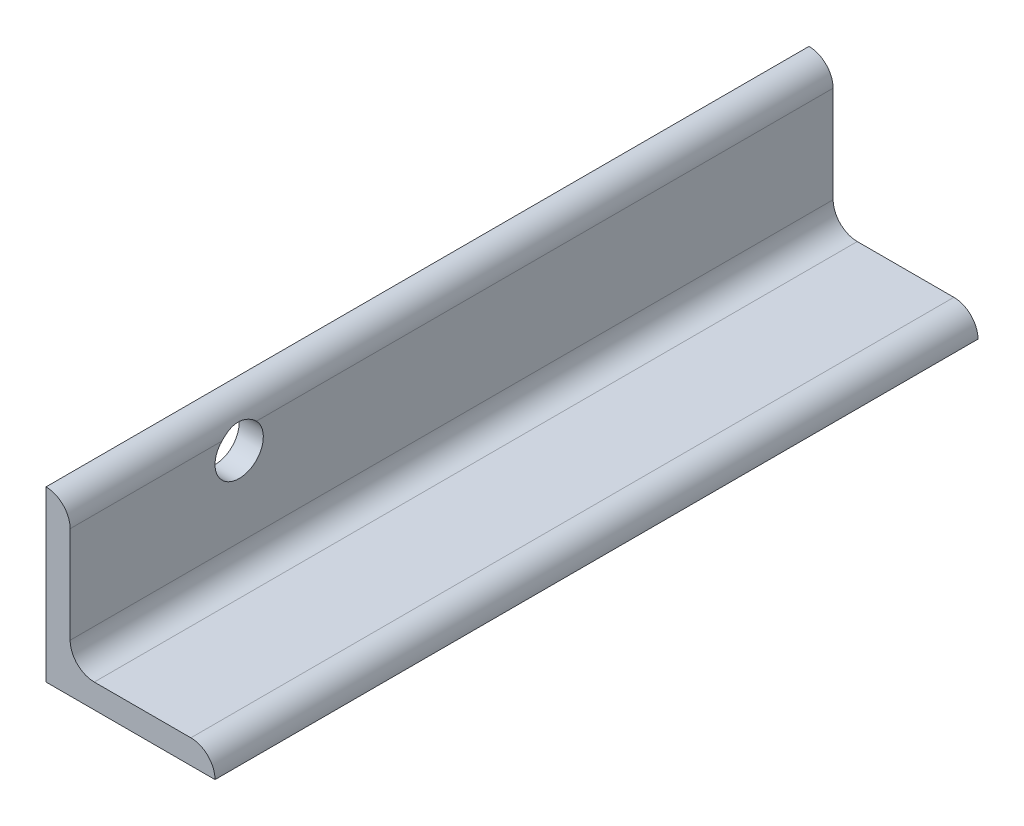
ISO-10303-21;
HEADER;
FILE_DESCRIPTION(('STEP AP214'),'2;1');
FILE_NAME('part.step','',(''),(''),'','','');
FILE_SCHEMA(('AUTOMOTIVE_DESIGN { 1 0 10303 214 1 1 1 1 }'));
ENDSEC;
DATA;
#1=APPLICATION_CONTEXT('core data for automotive mechanical design processes');
#2=APPLICATION_PROTOCOL_DEFINITION('international standard','automotive_design',2000,#1);
#3=PRODUCT_CONTEXT('',#1,'mechanical');
#4=PRODUCT('Part','Part','',(#3));
#5=PRODUCT_RELATED_PRODUCT_CATEGORY('part','',(#4));
#6=PRODUCT_DEFINITION_FORMATION('','',#4);
#7=PRODUCT_DEFINITION_CONTEXT('part definition',#1,'design');
#8=PRODUCT_DEFINITION('design','',#6,#7);
#9=PRODUCT_DEFINITION_SHAPE('','',#8);
#10=(LENGTH_UNIT() NAMED_UNIT(*) SI_UNIT(.MILLI.,.METRE.));
#11=(NAMED_UNIT(*) PLANE_ANGLE_UNIT() SI_UNIT($,.RADIAN.));
#12=(NAMED_UNIT(*) SI_UNIT($,.STERADIAN.) SOLID_ANGLE_UNIT());
#13=UNCERTAINTY_MEASURE_WITH_UNIT(LENGTH_MEASURE(1.E-05),#10,'distance_accuracy_value','');
#14=(GEOMETRIC_REPRESENTATION_CONTEXT(3) GLOBAL_UNCERTAINTY_ASSIGNED_CONTEXT((#13)) GLOBAL_UNIT_ASSIGNED_CONTEXT((#10,
#11,#12)) REPRESENTATION_CONTEXT('',''));
#15=CARTESIAN_POINT('',(0.,0.,0.));
#16=DIRECTION('',(0.,0.,1.));
#17=DIRECTION('',(1.,0.,0.));
#18=AXIS2_PLACEMENT_3D('',#15,#16,#17);
#19=CARTESIAN_POINT('',(0.,35.,-79.));
#20=DIRECTION('',(1.,0.,0.));
#21=DIRECTION('',(0.,0.,-1.));
#22=AXIS2_PLACEMENT_3D('',#19,#20,#21);
#23=PLANE('',#22);
#24=CARTESIAN_POINT('',(0.,26.5,44.));
#25=DIRECTION('',(-1.,0.,0.));
#26=DIRECTION('',(0.,0.,1.));
#27=AXIS2_PLACEMENT_3D('',#24,#25,#26);
#28=CIRCLE('',#27,4.99999999999999);
#29=CARTESIAN_POINT('',(0.,26.5,49.));
#30=VERTEX_POINT('',#29);
#31=EDGE_CURVE('E214',#30,#30,#28,.T.);
#32=ORIENTED_EDGE('',*,*,#31,.F.);
#33=EDGE_LOOP('',(#32));
#34=FACE_BOUND('',#33,.T.);
#35=DIRECTION('',(0.,1.,0.));
#36=VECTOR('',#35,1.);
#37=CARTESIAN_POINT('',(0.,35.,79.));
#38=LINE('',#37,#36);
#39=CARTESIAN_POINT('',(0.,0.,79.));
#40=VERTEX_POINT('',#39);
#41=CARTESIAN_POINT('',(0.,35.,79.));
#42=VERTEX_POINT('',#41);
#43=EDGE_CURVE('E163',#40,#42,#38,.T.);
#44=ORIENTED_EDGE('',*,*,#43,.T.);
#45=DIRECTION('',(0.,0.,1.));
#46=VECTOR('',#45,1.);
#47=CARTESIAN_POINT('',(0.,35.,-79.));
#48=LINE('',#47,#46);
#49=CARTESIAN_POINT('',(0.,35.,-79.));
#50=VERTEX_POINT('',#49);
#51=EDGE_CURVE('E71',#50,#42,#48,.T.);
#52=ORIENTED_EDGE('',*,*,#51,.F.);
#53=DIRECTION('',(0.,1.,0.));
#54=VECTOR('',#53,1.);
#55=CARTESIAN_POINT('',(0.,35.,-79.));
#56=LINE('',#55,#54);
#57=CARTESIAN_POINT('',(0.,0.,-79.));
#58=VERTEX_POINT('',#57);
#59=EDGE_CURVE('E177',#58,#50,#56,.T.);
#60=ORIENTED_EDGE('',*,*,#59,.F.);
#61=DIRECTION('',(0.,0.,1.));
#62=VECTOR('',#61,1.);
#63=CARTESIAN_POINT('',(0.,0.,-79.));
#64=LINE('',#63,#62);
#65=EDGE_CURVE('E159',#58,#40,#64,.T.);
#66=ORIENTED_EDGE('',*,*,#65,.T.);
#67=EDGE_LOOP('',(#44,#52,#60,#66));
#68=FACE_BOUND('',#67,.T.);
#69=ADVANCED_FACE('F64',(#34,#68),#23,.F.);
#70=CARTESIAN_POINT('',(0.,30.,-79.));
#71=DIRECTION('',(0.,0.,1.));
#72=DIRECTION('',(0.,-1.,0.));
#73=AXIS2_PLACEMENT_3D('',#70,#71,#72);
#74=CYLINDRICAL_SURFACE('',#73,5.);
#75=DIRECTION('',(0.,0.,1.));
#76=VECTOR('',#75,1.);
#77=CARTESIAN_POINT('',(5.,30.,-79.));
#78=LINE('',#77,#76);
#79=CARTESIAN_POINT('',(5.,30.,47.5707142142714));
#80=VERTEX_POINT('',#79);
#81=CARTESIAN_POINT('',(5.,30.,79.));
#82=VERTEX_POINT('',#81);
#83=EDGE_CURVE('E184',#80,#82,#78,.T.);
#84=ORIENTED_EDGE('',*,*,#83,.F.);
#85=CARTESIAN_POINT('',(5.,30.,47.5707142142714));
#86=CARTESIAN_POINT('',(4.9999955252737,30.0992819849625,47.473423434583));
#87=CARTESIAN_POINT('',(4.99704325014133,30.1944403785129,47.3720089482987));
#88=CARTESIAN_POINT('',(4.98668256702425,30.3758392116425,47.1618158888214));
#89=CARTESIAN_POINT('',(4.97927715991236,30.4620856110049,47.0530423185313));
#90=CARTESIAN_POINT('',(4.96144893950854,30.6250963501032,46.8289206121453));
#91=CARTESIAN_POINT('',(4.95102718684203,30.7018640092974,46.713574798451));
#92=CARTESIAN_POINT('',(4.92852787951654,30.8455181978565,46.4770183665137));
#93=CARTESIAN_POINT('',(4.91645005287137,30.9124031003649,46.3558067870238));
#94=CARTESIAN_POINT('',(4.89194044083007,31.035795022588,46.1084681135975));
#95=CARTESIAN_POINT('',(4.87950919105075,31.0923168705965,45.9823483611503));
#96=CARTESIAN_POINT('',(4.85544416888814,31.1947517955454,45.7257988298954));
#97=CARTESIAN_POINT('',(4.84381037792748,31.2406651196779,45.5953691515955));
#98=CARTESIAN_POINT('',(4.82237213651918,31.3215440043627,45.3310888911166));
#99=CARTESIAN_POINT('',(4.81256664634913,31.3565157948914,45.1972403027589));
#100=CARTESIAN_POINT('',(4.79561664717994,31.4152731219617,44.9269398601492));
#101=CARTESIAN_POINT('',(4.78847212835649,31.4390586998029,44.7904880155104));
#102=CARTESIAN_POINT('',(4.77740116692676,31.475399769562,44.5146996377305));
#103=CARTESIAN_POINT('',(4.77350452904374,31.4878513467612,44.3753481621218));
#104=CARTESIAN_POINT('',(4.76937628726945,31.5010323459869,44.0960355167987));
#105=CARTESIAN_POINT('',(4.76914470761678,31.5017616904893,43.9560743430583));
#106=CARTESIAN_POINT('',(4.77236719888181,31.4914891406126,43.6765868105425));
#107=CARTESIAN_POINT('',(4.7758223207435,31.4804839011326,43.5370605871297));
#108=CARTESIAN_POINT('',(4.78612026343925,31.4468449187905,43.2595514866308));
#109=CARTESIAN_POINT('',(4.79296302165411,31.4242113908725,43.1215685810654));
#110=CARTESIAN_POINT('',(4.80914542675123,31.3685497131437,42.8531274217182));
#111=CARTESIAN_POINT('',(4.81838493073622,31.3359306790842,42.7225782526745));
#112=CARTESIAN_POINT('',(4.83870619122663,31.2603341486235,42.4646470716953));
#113=CARTESIAN_POINT('',(4.84978864323665,31.2173527388317,42.3372662764053));
#114=CARTESIAN_POINT('',(4.88444592948586,31.0733233823651,41.9612221130374));
#115=CARTESIAN_POINT('',(4.90945709091694,30.9571142603212,41.7182925025755));
#116=CARTESIAN_POINT('',(4.95066993631903,30.7097562793251,41.2929834930599));
#117=CARTESIAN_POINT('',(4.96764565287441,30.5843912878894,41.1072858051597));
#118=CARTESIAN_POINT('',(4.98614159453619,30.3783500662403,40.8423220737439));
#119=CARTESIAN_POINT('',(4.99114604134407,30.3066491489386,40.7562434569024));
#120=CARTESIAN_POINT('',(4.99807507563759,30.1575291307995,40.5889806170967));
#121=CARTESIAN_POINT('',(4.99999800328477,30.0801069717261,40.5077990545358));
#122=CARTESIAN_POINT('',(5.,30.,40.4292857857286));
#123=B_SPLINE_CURVE_WITH_KNOTS('',3,(#85,#86,#87,#88,#89,#90,#91,#92,#93,#94,#95,#96,#97,#98,
#99,#100,#101,#102,#103,#104,#105,#106,#107,#108,#109,#110,#111,#112,#113,#114,#115,#116,#117,
#118,#119,#120,#121,#122),.UNSPECIFIED.,.F.,.F.,(4,2,2,2,2,2,2,2,2,2,2,2,2,2,2,2,2,2,4),(0.,
0.416779785975336,0.833279026987509,1.24963199360785,1.66605342226771,2.08187427044305,
2.49768542847917,2.91325939599305,3.32883182919225,3.74817710786149,4.16752515984134,
4.58699278458508,5.00645265591687,5.41061761437841,5.8149354470259,6.62246422936048,
7.29441636826766,7.63057203833212,7.96690871547757),.UNSPECIFIED.);
#124=CARTESIAN_POINT('',(5.,30.,40.4292857857286));
#125=VERTEX_POINT('',#124);
#126=EDGE_CURVE('E77',#80,#125,#123,.T.);
#127=ORIENTED_EDGE('',*,*,#126,.T.);
#128=CARTESIAN_POINT('',(5.,30.,-79.));
#129=VERTEX_POINT('',#128);
#130=EDGE_CURVE('E185',#129,#125,#78,.T.);
#131=ORIENTED_EDGE('',*,*,#130,.F.);
#132=CARTESIAN_POINT('',(0.,30.,-79.));
#133=DIRECTION('',(0.,0.,-1.));
#134=DIRECTION('',(0.,1.,0.));
#135=AXIS2_PLACEMENT_3D('',#132,#133,#134);
#136=CIRCLE('',#135,5.);
#137=EDGE_CURVE('E124',#50,#129,#136,.T.);
#138=ORIENTED_EDGE('',*,*,#137,.F.);
#139=ORIENTED_EDGE('',*,*,#51,.T.);
#140=CARTESIAN_POINT('',(0.,30.,79.));
#141=DIRECTION('',(0.,0.,-1.));
#142=DIRECTION('',(0.,1.,0.));
#143=AXIS2_PLACEMENT_3D('',#140,#141,#142);
#144=CIRCLE('',#143,5.);
#145=EDGE_CURVE('E166',#42,#82,#144,.T.);
#146=ORIENTED_EDGE('',*,*,#145,.T.);
#147=EDGE_LOOP('',(#84,#127,#131,#138,#139,#146));
#148=FACE_BOUND('',#147,.T.);
#149=ADVANCED_FACE('F189',(#148),#74,.T.);
#150=CARTESIAN_POINT('',(5.,10.,-79.));
#151=DIRECTION('',(-1.,0.,0.));
#152=DIRECTION('',(0.,-1.,0.));
#153=AXIS2_PLACEMENT_3D('',#150,#151,#152);
#154=PLANE('',#153);
#155=ORIENTED_EDGE('',*,*,#130,.T.);
#156=CARTESIAN_POINT('',(5.,26.5,44.));
#157=DIRECTION('',(-1.,0.,0.));
#158=DIRECTION('',(0.,-1.,0.));
#159=AXIS2_PLACEMENT_3D('',#156,#157,#158);
#160=CIRCLE('',#159,4.99999999999999);
#161=EDGE_CURVE('E13',#125,#80,#160,.T.);
#162=ORIENTED_EDGE('',*,*,#161,.T.);
#163=ORIENTED_EDGE('',*,*,#83,.T.);
#164=DIRECTION('',(0.,-1.,0.));
#165=VECTOR('',#164,1.);
#166=CARTESIAN_POINT('',(5.,10.,79.));
#167=LINE('',#166,#165);
#168=CARTESIAN_POINT('',(5.,10.,79.));
#169=VERTEX_POINT('',#168);
#170=EDGE_CURVE('E169',#82,#169,#167,.T.);
#171=ORIENTED_EDGE('',*,*,#170,.T.);
#172=DIRECTION('',(0.,0.,1.));
#173=VECTOR('',#172,1.);
#174=CARTESIAN_POINT('',(5.,10.,-79.));
#175=LINE('',#174,#173);
#176=CARTESIAN_POINT('',(5.,10.,-79.));
#177=VERTEX_POINT('',#176);
#178=EDGE_CURVE('E181',#177,#169,#175,.T.);
#179=ORIENTED_EDGE('',*,*,#178,.F.);
#180=DIRECTION('',(0.,-1.,0.));
#181=VECTOR('',#180,1.);
#182=CARTESIAN_POINT('',(5.,10.,-79.));
#183=LINE('',#182,#181);
#184=EDGE_CURVE('E203',#129,#177,#183,.T.);
#185=ORIENTED_EDGE('',*,*,#184,.F.);
#186=EDGE_LOOP('',(#155,#162,#163,#171,#179,#185));
#187=FACE_BOUND('',#186,.T.);
#188=ADVANCED_FACE('F199',(#187),#154,.F.);
#189=CARTESIAN_POINT('',(10.,10.,-79.));
#190=DIRECTION('',(0.,0.,1.));
#191=DIRECTION('',(0.,-1.,0.));
#192=AXIS2_PLACEMENT_3D('',#189,#190,#191);
#193=CYLINDRICAL_SURFACE('',#192,5.);
#194=CARTESIAN_POINT('',(10.,10.,79.));
#195=DIRECTION('',(0.,0.,1.));
#196=DIRECTION('',(0.,-1.,0.));
#197=AXIS2_PLACEMENT_3D('',#194,#195,#196);
#198=CIRCLE('',#197,5.);
#199=CARTESIAN_POINT('',(10.,5.,79.));
#200=VERTEX_POINT('',#199);
#201=EDGE_CURVE('E171',#169,#200,#198,.T.);
#202=ORIENTED_EDGE('',*,*,#201,.T.);
#203=DIRECTION('',(0.,0.,1.));
#204=VECTOR('',#203,1.);
#205=CARTESIAN_POINT('',(10.,5.00000000000003,-79.));
#206=LINE('',#205,#204);
#207=CARTESIAN_POINT('',(10.,5.00000000000003,-79.));
#208=VERTEX_POINT('',#207);
#209=EDGE_CURVE('E154',#208,#200,#206,.T.);
#210=ORIENTED_EDGE('',*,*,#209,.F.);
#211=CARTESIAN_POINT('',(10.,10.,-79.));
#212=DIRECTION('',(0.,0.,1.));
#213=DIRECTION('',(0.,-1.,0.));
#214=AXIS2_PLACEMENT_3D('',#211,#212,#213);
#215=CIRCLE('',#214,5.);
#216=EDGE_CURVE('E142',#177,#208,#215,.T.);
#217=ORIENTED_EDGE('',*,*,#216,.F.);
#218=ORIENTED_EDGE('',*,*,#178,.T.);
#219=EDGE_LOOP('',(#202,#210,#217,#218));
#220=FACE_BOUND('',#219,.T.);
#221=ADVANCED_FACE('F202',(#220),#193,.F.);
#222=CARTESIAN_POINT('',(30.,5.00000000000002,-79.));
#223=DIRECTION('',(0.,-1.,0.));
#224=DIRECTION('',(0.,0.,-1.));
#225=AXIS2_PLACEMENT_3D('',#222,#223,#224);
#226=PLANE('',#225);
#227=DIRECTION('',(1.,0.,0.));
#228=VECTOR('',#227,1.);
#229=CARTESIAN_POINT('',(30.,5.,79.));
#230=LINE('',#229,#228);
#231=CARTESIAN_POINT('',(30.,5.,79.));
#232=VERTEX_POINT('',#231);
#233=EDGE_CURVE('E151',#200,#232,#230,.T.);
#234=ORIENTED_EDGE('',*,*,#233,.T.);
#235=DIRECTION('',(0.,0.,1.));
#236=VECTOR('',#235,1.);
#237=CARTESIAN_POINT('',(30.,5.00000000000003,-79.));
#238=LINE('',#237,#236);
#239=CARTESIAN_POINT('',(30.,5.00000000000003,-79.));
#240=VERTEX_POINT('',#239);
#241=EDGE_CURVE('E148',#240,#232,#238,.T.);
#242=ORIENTED_EDGE('',*,*,#241,.F.);
#243=DIRECTION('',(1.,0.,0.));
#244=VECTOR('',#243,1.);
#245=CARTESIAN_POINT('',(30.,5.00000000000002,-79.));
#246=LINE('',#245,#244);
#247=EDGE_CURVE('E135',#208,#240,#246,.T.);
#248=ORIENTED_EDGE('',*,*,#247,.F.);
#249=ORIENTED_EDGE('',*,*,#209,.T.);
#250=EDGE_LOOP('',(#234,#242,#248,#249));
#251=FACE_BOUND('',#250,.T.);
#252=ADVANCED_FACE('F149',(#251),#226,.F.);
#253=CARTESIAN_POINT('',(30.,0.,-79.));
#254=DIRECTION('',(0.,0.,1.));
#255=DIRECTION('',(0.,-1.,0.));
#256=AXIS2_PLACEMENT_3D('',#253,#254,#255);
#257=CYLINDRICAL_SURFACE('',#256,5.);
#258=CARTESIAN_POINT('',(30.,0.,79.));
#259=DIRECTION('',(0.,0.,-1.));
#260=DIRECTION('',(0.,-1.,0.));
#261=AXIS2_PLACEMENT_3D('',#258,#259,#260);
#262=CIRCLE('',#261,5.);
#263=CARTESIAN_POINT('',(35.,0.,79.));
#264=VERTEX_POINT('',#263);
#265=EDGE_CURVE('E174',#232,#264,#262,.T.);
#266=ORIENTED_EDGE('',*,*,#265,.T.);
#267=DIRECTION('',(0.,0.,1.));
#268=VECTOR('',#267,1.);
#269=CARTESIAN_POINT('',(35.,0.,-79.));
#270=LINE('',#269,#268);
#271=CARTESIAN_POINT('',(35.,0.,-79.));
#272=VERTEX_POINT('',#271);
#273=EDGE_CURVE('E155',#272,#264,#270,.T.);
#274=ORIENTED_EDGE('',*,*,#273,.F.);
#275=CARTESIAN_POINT('',(30.,0.,-79.));
#276=DIRECTION('',(0.,0.,-1.));
#277=DIRECTION('',(0.,-1.,0.));
#278=AXIS2_PLACEMENT_3D('',#275,#276,#277);
#279=CIRCLE('',#278,5.);
#280=EDGE_CURVE('E139',#240,#272,#279,.T.);
#281=ORIENTED_EDGE('',*,*,#280,.F.);
#282=ORIENTED_EDGE('',*,*,#241,.T.);
#283=EDGE_LOOP('',(#266,#274,#281,#282));
#284=FACE_BOUND('',#283,.T.);
#285=ADVANCED_FACE('F157',(#284),#257,.T.);
#286=CARTESIAN_POINT('',(0.,0.,-79.));
#287=DIRECTION('',(0.,1.,0.));
#288=DIRECTION('',(0.,0.,1.));
#289=AXIS2_PLACEMENT_3D('',#286,#287,#288);
#290=PLANE('',#289);
#291=DIRECTION('',(-1.,0.,0.));
#292=VECTOR('',#291,1.);
#293=CARTESIAN_POINT('',(0.,0.,79.));
#294=LINE('',#293,#292);
#295=EDGE_CURVE('E115',#264,#40,#294,.T.);
#296=ORIENTED_EDGE('',*,*,#295,.T.);
#297=ORIENTED_EDGE('',*,*,#65,.F.);
#298=DIRECTION('',(-1.,0.,0.));
#299=VECTOR('',#298,1.);
#300=CARTESIAN_POINT('',(0.,0.,-79.));
#301=LINE('',#300,#299);
#302=EDGE_CURVE('E85',#272,#58,#301,.T.);
#303=ORIENTED_EDGE('',*,*,#302,.F.);
#304=ORIENTED_EDGE('',*,*,#273,.T.);
#305=EDGE_LOOP('',(#296,#297,#303,#304));
#306=FACE_BOUND('',#305,.T.);
#307=ADVANCED_FACE('F224',(#306),#290,.F.);
#308=CARTESIAN_POINT('',(30.,0.,-79.));
#309=DIRECTION('',(0.,0.,1.));
#310=DIRECTION('',(0.,-1.,0.));
#311=AXIS2_PLACEMENT_3D('',#308,#309,#310);
#312=PLANE('',#311);
#313=ORIENTED_EDGE('',*,*,#59,.T.);
#314=ORIENTED_EDGE('',*,*,#137,.T.);
#315=ORIENTED_EDGE('',*,*,#184,.T.);
#316=ORIENTED_EDGE('',*,*,#216,.T.);
#317=ORIENTED_EDGE('',*,*,#247,.T.);
#318=ORIENTED_EDGE('',*,*,#280,.T.);
#319=ORIENTED_EDGE('',*,*,#302,.T.);
#320=EDGE_LOOP('',(#313,#314,#315,#316,#317,#318,#319));
#321=FACE_BOUND('',#320,.T.);
#322=ADVANCED_FACE('F137',(#321),#312,.F.);
#323=CARTESIAN_POINT('',(30.,0.,79.));
#324=DIRECTION('',(0.,0.,1.));
#325=DIRECTION('',(0.,-1.,0.));
#326=AXIS2_PLACEMENT_3D('',#323,#324,#325);
#327=PLANE('',#326);
#328=ORIENTED_EDGE('',*,*,#43,.F.);
#329=ORIENTED_EDGE('',*,*,#295,.F.);
#330=ORIENTED_EDGE('',*,*,#265,.F.);
#331=ORIENTED_EDGE('',*,*,#233,.F.);
#332=ORIENTED_EDGE('',*,*,#201,.F.);
#333=ORIENTED_EDGE('',*,*,#170,.F.);
#334=ORIENTED_EDGE('',*,*,#145,.F.);
#335=EDGE_LOOP('',(#328,#329,#330,#331,#332,#333,#334));
#336=FACE_BOUND('',#335,.T.);
#337=ADVANCED_FACE('F195',(#336),#327,.T.);
#338=CARTESIAN_POINT('',(10.,26.5,44.));
#339=DIRECTION('',(-1.,0.,0.));
#340=DIRECTION('',(0.,0.,1.));
#341=AXIS2_PLACEMENT_3D('',#338,#339,#340);
#342=CYLINDRICAL_SURFACE('',#341,4.99999999999999);
#343=ORIENTED_EDGE('',*,*,#31,.T.);
#344=EDGE_LOOP('',(#343));
#345=FACE_BOUND('',#344,.T.);
#346=ORIENTED_EDGE('',*,*,#161,.F.);
#347=ORIENTED_EDGE('',*,*,#126,.F.);
#348=EDGE_LOOP('',(#346,#347));
#349=FACE_BOUND('',#348,.T.);
#350=ADVANCED_FACE('F217',(#345,#349),#342,.F.);
#351=CLOSED_SHELL('',(#69,#149,#188,#221,#252,#285,#307,#322,#337,#350));
#352=MANIFOLD_SOLID_BREP('B2',#351);
#353=ADVANCED_BREP_SHAPE_REPRESENTATION('',(#18,#352),#14);
#354=SHAPE_DEFINITION_REPRESENTATION(#9,#353);
ENDSEC;
END-ISO-10303-21;
